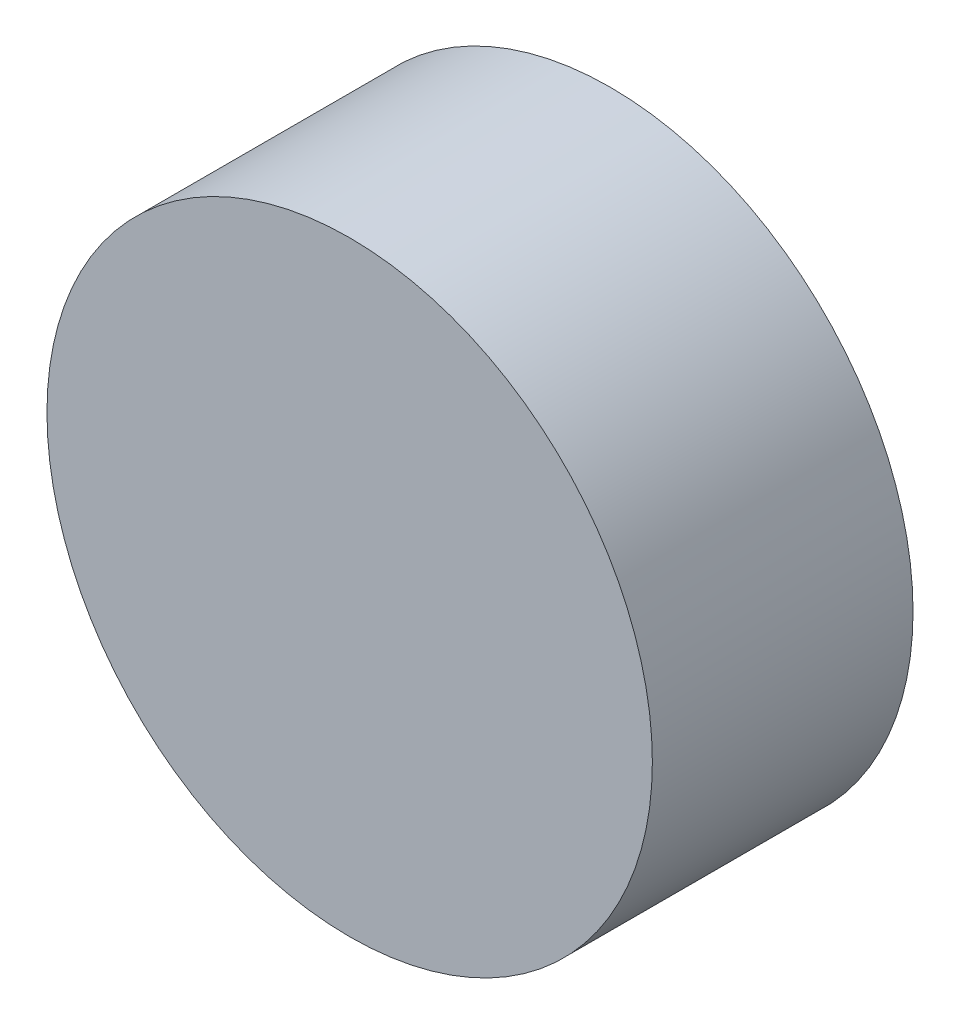
ISO-10303-21;
HEADER;
FILE_DESCRIPTION(('STEP AP214'),'2;1');
FILE_NAME('part.step','',(''),(''),'','','');
FILE_SCHEMA(('AUTOMOTIVE_DESIGN { 1 0 10303 214 1 1 1 1 }'));
ENDSEC;
DATA;
#1=APPLICATION_CONTEXT('core data for automotive mechanical design processes');
#2=APPLICATION_PROTOCOL_DEFINITION('international standard','automotive_design',2000,#1);
#3=PRODUCT_CONTEXT('',#1,'mechanical');
#4=PRODUCT('Part','Part','',(#3));
#5=PRODUCT_RELATED_PRODUCT_CATEGORY('part','',(#4));
#6=PRODUCT_DEFINITION_FORMATION('','',#4);
#7=PRODUCT_DEFINITION_CONTEXT('part definition',#1,'design');
#8=PRODUCT_DEFINITION('design','',#6,#7);
#9=PRODUCT_DEFINITION_SHAPE('','',#8);
#10=(LENGTH_UNIT() NAMED_UNIT(*) SI_UNIT(.MILLI.,.METRE.));
#11=(NAMED_UNIT(*) PLANE_ANGLE_UNIT() SI_UNIT($,.RADIAN.));
#12=(NAMED_UNIT(*) SI_UNIT($,.STERADIAN.) SOLID_ANGLE_UNIT());
#13=UNCERTAINTY_MEASURE_WITH_UNIT(LENGTH_MEASURE(1.E-05),#10,'distance_accuracy_value','');
#14=(GEOMETRIC_REPRESENTATION_CONTEXT(3) GLOBAL_UNCERTAINTY_ASSIGNED_CONTEXT((#13)) GLOBAL_UNIT_ASSIGNED_CONTEXT((#10,
#11,#12)) REPRESENTATION_CONTEXT('',''));
#15=CARTESIAN_POINT('',(0.,0.,0.));
#16=DIRECTION('',(0.,0.,1.));
#17=DIRECTION('',(1.,0.,0.));
#18=AXIS2_PLACEMENT_3D('',#15,#16,#17);
#19=CARTESIAN_POINT('',(0.00340061004067312,0.,8.034840547133));
#20=DIRECTION('',(0.,0.,-1.));
#21=DIRECTION('',(-1.,0.,0.));
#22=AXIS2_PLACEMENT_3D('',#19,#20,#21);
#23=CYLINDRICAL_SURFACE('',#22,17.402);
#24=CARTESIAN_POINT('',(0.00340061004067263,0.,4.03484054713301));
#25=DIRECTION('',(0.,0.,-1.));
#26=DIRECTION('',(-1.,0.,0.));
#27=AXIS2_PLACEMENT_3D('',#24,#25,#26);
#28=CIRCLE('',#27,17.402);
#29=CARTESIAN_POINT('',(-17.3985993899593,0.,4.03484054713301));
#30=VERTEX_POINT('',#29);
#31=EDGE_CURVE('E10',#30,#30,#28,.T.);
#32=ORIENTED_EDGE('',*,*,#31,.F.);
#33=EDGE_LOOP('',(#32));
#34=FACE_BOUND('',#33,.T.);
#35=CARTESIAN_POINT('',(0.00340061004067238,0.,2.03484054713301));
#36=DIRECTION('',(0.,0.,-1.));
#37=DIRECTION('',(-1.,0.,0.));
#38=AXIS2_PLACEMENT_3D('',#35,#36,#37);
#39=CIRCLE('',#38,17.402);
#40=CARTESIAN_POINT('',(-17.3985993899593,0.,2.03484054713301));
#41=VERTEX_POINT('',#40);
#42=EDGE_CURVE('E62',#41,#41,#39,.T.);
#43=ORIENTED_EDGE('',*,*,#42,.T.);
#44=EDGE_LOOP('',(#43));
#45=FACE_BOUND('',#44,.T.);
#46=ADVANCED_FACE('F34',(#34,#45),#23,.F.);
#47=CARTESIAN_POINT('',(17.4054006100407,0.,4.034840547133));
#48=DIRECTION('',(0.,0.,-1.));
#49=DIRECTION('',(-1.,0.,0.));
#50=AXIS2_PLACEMENT_3D('',#47,#48,#49);
#51=PLANE('',#50);
#52=CARTESIAN_POINT('',(0.00340061004067263,0.,4.03484054713301));
#53=DIRECTION('',(0.,0.,-1.));
#54=DIRECTION('',(-1.,0.,0.));
#55=AXIS2_PLACEMENT_3D('',#52,#53,#54);
#56=CIRCLE('',#55,18.902);
#57=CARTESIAN_POINT('',(-18.8985993899593,0.,4.03484054713301));
#58=VERTEX_POINT('',#57);
#59=EDGE_CURVE('E40',#58,#58,#56,.T.);
#60=ORIENTED_EDGE('',*,*,#59,.F.);
#61=EDGE_LOOP('',(#60));
#62=FACE_BOUND('',#61,.T.);
#63=ORIENTED_EDGE('',*,*,#31,.T.);
#64=EDGE_LOOP('',(#63));
#65=FACE_BOUND('',#64,.T.);
#66=ADVANCED_FACE('F102',(#62,#65),#51,.F.);
#67=CARTESIAN_POINT('',(0.00340061004067312,0.,8.034840547133));
#68=DIRECTION('',(0.,0.,-1.));
#69=DIRECTION('',(-1.,0.,0.));
#70=AXIS2_PLACEMENT_3D('',#67,#68,#69);
#71=CYLINDRICAL_SURFACE('',#70,18.902);
#72=CARTESIAN_POINT('',(0.00340061004067312,0.,8.034840547133));
#73=DIRECTION('',(0.,0.,-1.));
#74=DIRECTION('',(-1.,0.,0.));
#75=AXIS2_PLACEMENT_3D('',#72,#73,#74);
#76=CIRCLE('',#75,18.902);
#77=CARTESIAN_POINT('',(-18.8985993899593,0.,8.03484054713301));
#78=VERTEX_POINT('',#77);
#79=EDGE_CURVE('E44',#78,#78,#76,.T.);
#80=ORIENTED_EDGE('',*,*,#79,.F.);
#81=EDGE_LOOP('',(#80));
#82=FACE_BOUND('',#81,.T.);
#83=ORIENTED_EDGE('',*,*,#59,.T.);
#84=EDGE_LOOP('',(#83));
#85=FACE_BOUND('',#84,.T.);
#86=ADVANCED_FACE('F98',(#82,#85),#71,.F.);
#87=CARTESIAN_POINT('',(0.00340061004067312,0.,8.034840547133));
#88=DIRECTION('',(0.,0.,1.));
#89=DIRECTION('',(1.,0.,0.));
#90=AXIS2_PLACEMENT_3D('',#87,#88,#89);
#91=PLANE('',#90);
#92=ORIENTED_EDGE('',*,*,#79,.T.);
#93=EDGE_LOOP('',(#92));
#94=FACE_BOUND('',#93,.T.);
#95=ADVANCED_FACE('F93',(#94),#91,.F.);
#96=CARTESIAN_POINT('',(0.00340061004067336,0.,10.034840547133));
#97=DIRECTION('',(0.,0.,-1.));
#98=DIRECTION('',(-1.,0.,0.));
#99=AXIS2_PLACEMENT_3D('',#96,#97,#98);
#100=PLANE('',#99);
#101=CARTESIAN_POINT('',(0.00340061004067336,0.,10.034840547133));
#102=DIRECTION('',(0.,0.,-1.));
#103=DIRECTION('',(-1.,0.,0.));
#104=AXIS2_PLACEMENT_3D('',#101,#102,#103);
#105=CIRCLE('',#104,20.902);
#106=CARTESIAN_POINT('',(-20.8985993899593,0.,10.034840547133));
#107=VERTEX_POINT('',#106);
#108=EDGE_CURVE('E48',#107,#107,#105,.T.);
#109=ORIENTED_EDGE('',*,*,#108,.F.);
#110=EDGE_LOOP('',(#109));
#111=FACE_BOUND('',#110,.T.);
#112=ADVANCED_FACE('F88',(#111),#100,.F.);
#113=CARTESIAN_POINT('',(0.00340061004067312,0.,8.034840547133));
#114=DIRECTION('',(0.,0.,-1.));
#115=DIRECTION('',(-1.,0.,0.));
#116=AXIS2_PLACEMENT_3D('',#113,#114,#115);
#117=CYLINDRICAL_SURFACE('',#116,20.902);
#118=CARTESIAN_POINT('',(0.00340061004067116,0.,-7.96515945286699));
#119=DIRECTION('',(0.,0.,-1.));
#120=DIRECTION('',(-1.,0.,0.));
#121=AXIS2_PLACEMENT_3D('',#118,#119,#120);
#122=CIRCLE('',#121,20.902);
#123=CARTESIAN_POINT('',(-20.8985993899593,0.,-7.96515945286699));
#124=VERTEX_POINT('',#123);
#125=EDGE_CURVE('E53',#124,#124,#122,.T.);
#126=ORIENTED_EDGE('',*,*,#125,.F.);
#127=EDGE_LOOP('',(#126));
#128=FACE_BOUND('',#127,.T.);
#129=ORIENTED_EDGE('',*,*,#108,.T.);
#130=EDGE_LOOP('',(#129));
#131=FACE_BOUND('',#130,.T.);
#132=ADVANCED_FACE('F82',(#128,#131),#117,.T.);
#133=CARTESIAN_POINT('',(20.9054006100407,0.,-7.965159452867));
#134=DIRECTION('',(0.,0.,1.));
#135=DIRECTION('',(1.,0.,0.));
#136=AXIS2_PLACEMENT_3D('',#133,#134,#135);
#137=PLANE('',#136);
#138=CARTESIAN_POINT('',(0.00340061004067116,0.,-7.96515945286699));
#139=DIRECTION('',(0.,0.,-1.));
#140=DIRECTION('',(-1.,0.,0.));
#141=AXIS2_PLACEMENT_3D('',#138,#139,#140);
#142=CIRCLE('',#141,18.902);
#143=CARTESIAN_POINT('',(-18.8985993899593,0.,-7.96515945286699));
#144=VERTEX_POINT('',#143);
#145=EDGE_CURVE('E56',#144,#144,#142,.T.);
#146=ORIENTED_EDGE('',*,*,#145,.F.);
#147=EDGE_LOOP('',(#146));
#148=FACE_BOUND('',#147,.T.);
#149=ORIENTED_EDGE('',*,*,#125,.T.);
#150=EDGE_LOOP('',(#149));
#151=FACE_BOUND('',#150,.T.);
#152=ADVANCED_FACE('F76',(#148,#151),#137,.F.);
#153=CARTESIAN_POINT('',(0.00340061004067312,0.,8.034840547133));
#154=DIRECTION('',(0.,0.,-1.));
#155=DIRECTION('',(-1.,0.,0.));
#156=AXIS2_PLACEMENT_3D('',#153,#154,#155);
#157=CYLINDRICAL_SURFACE('',#156,18.902);
#158=CARTESIAN_POINT('',(0.00340061004067238,0.,2.03484054713301));
#159=DIRECTION('',(0.,0.,-1.));
#160=DIRECTION('',(-1.,0.,0.));
#161=AXIS2_PLACEMENT_3D('',#158,#159,#160);
#162=CIRCLE('',#161,18.902);
#163=CARTESIAN_POINT('',(-18.8985993899593,0.,2.03484054713301));
#164=VERTEX_POINT('',#163);
#165=EDGE_CURVE('E59',#164,#164,#162,.T.);
#166=ORIENTED_EDGE('',*,*,#165,.F.);
#167=EDGE_LOOP('',(#166));
#168=FACE_BOUND('',#167,.T.);
#169=ORIENTED_EDGE('',*,*,#145,.T.);
#170=EDGE_LOOP('',(#169));
#171=FACE_BOUND('',#170,.T.);
#172=ADVANCED_FACE('F70',(#168,#171),#157,.F.);
#173=CARTESIAN_POINT('',(18.9054006100407,0.,2.034840547133));
#174=DIRECTION('',(0.,0.,1.));
#175=DIRECTION('',(1.,0.,0.));
#176=AXIS2_PLACEMENT_3D('',#173,#174,#175);
#177=PLANE('',#176);
#178=ORIENTED_EDGE('',*,*,#42,.F.);
#179=EDGE_LOOP('',(#178));
#180=FACE_BOUND('',#179,.T.);
#181=ORIENTED_EDGE('',*,*,#165,.T.);
#182=EDGE_LOOP('',(#181));
#183=FACE_BOUND('',#182,.T.);
#184=ADVANCED_FACE('F67',(#180,#183),#177,.F.);
#185=CLOSED_SHELL('',(#46,#66,#86,#95,#112,#132,#152,#172,#184));
#186=MANIFOLD_SOLID_BREP('B2',#185);
#187=ADVANCED_BREP_SHAPE_REPRESENTATION('',(#18,#186),#14);
#188=SHAPE_DEFINITION_REPRESENTATION(#9,#187);
ENDSEC;
END-ISO-10303-21;
